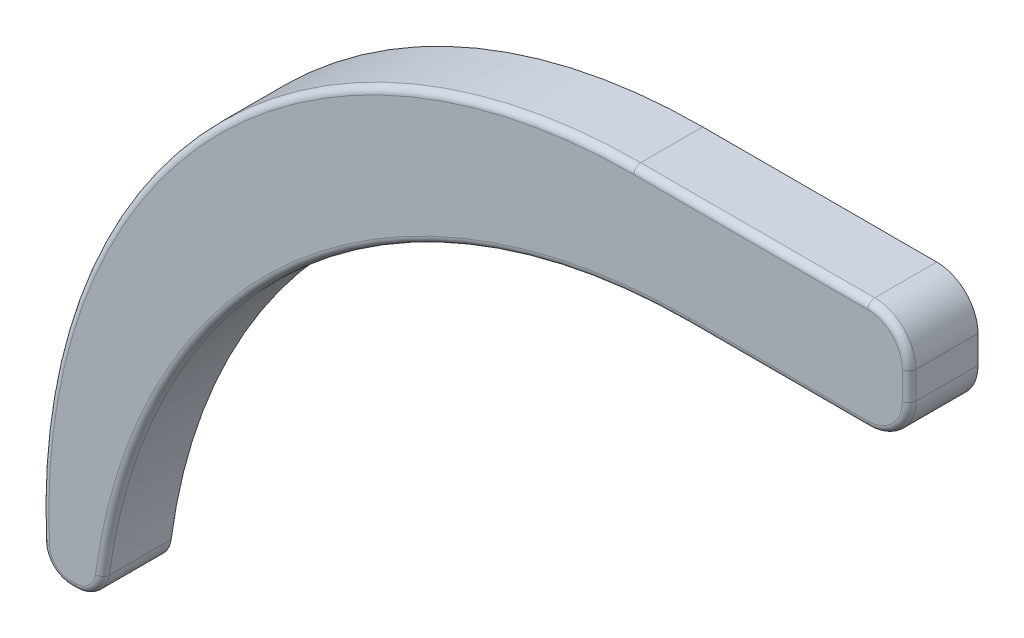
ISO-10303-21;
HEADER;
FILE_DESCRIPTION(('STEP AP214'),'2;1');
FILE_NAME('part.step','',(''),(''),'','','');
FILE_SCHEMA(('AUTOMOTIVE_DESIGN { 1 0 10303 214 1 1 1 1 }'));
ENDSEC;
DATA;
#1=APPLICATION_CONTEXT('core data for automotive mechanical design processes');
#2=APPLICATION_PROTOCOL_DEFINITION('international standard','automotive_design',2000,#1);
#3=PRODUCT_CONTEXT('',#1,'mechanical');
#4=PRODUCT('Part','Part','',(#3));
#5=PRODUCT_RELATED_PRODUCT_CATEGORY('part','',(#4));
#6=PRODUCT_DEFINITION_FORMATION('','',#4);
#7=PRODUCT_DEFINITION_CONTEXT('part definition',#1,'design');
#8=PRODUCT_DEFINITION('design','',#6,#7);
#9=PRODUCT_DEFINITION_SHAPE('','',#8);
#10=(LENGTH_UNIT() NAMED_UNIT(*) SI_UNIT(.MILLI.,.METRE.));
#11=(NAMED_UNIT(*) PLANE_ANGLE_UNIT() SI_UNIT($,.RADIAN.));
#12=(NAMED_UNIT(*) SI_UNIT($,.STERADIAN.) SOLID_ANGLE_UNIT());
#13=UNCERTAINTY_MEASURE_WITH_UNIT(LENGTH_MEASURE(1.E-05),#10,'distance_accuracy_value','');
#14=(GEOMETRIC_REPRESENTATION_CONTEXT(3) GLOBAL_UNCERTAINTY_ASSIGNED_CONTEXT((#13)) GLOBAL_UNIT_ASSIGNED_CONTEXT((#10,
#11,#12)) REPRESENTATION_CONTEXT('',''));
#15=CARTESIAN_POINT('',(0.,0.,0.));
#16=DIRECTION('',(0.,0.,1.));
#17=DIRECTION('',(1.,0.,0.));
#18=AXIS2_PLACEMENT_3D('',#15,#16,#17);
#19=CARTESIAN_POINT('',(0.352984216931022,2.,5.));
#20=DIRECTION('',(0.,0.,-1.));
#21=DIRECTION('',(-1.,0.,0.));
#22=AXIS2_PLACEMENT_3D('',#19,#20,#21);
#23=CYLINDRICAL_SURFACE('',#22,2.);
#24=DIRECTION('',(0.,0.,-1.));
#25=VECTOR('',#24,1.);
#26=CARTESIAN_POINT('',(2.33512671657349,1.73333333333333,5.));
#27=LINE('',#26,#25);
#28=CARTESIAN_POINT('',(2.33512671657349,1.73333333333333,4.5));
#29=VERTEX_POINT('',#28);
#30=CARTESIAN_POINT('',(2.33512671657349,1.73333333333333,0.));
#31=VERTEX_POINT('',#30);
#32=EDGE_CURVE('E141',#29,#31,#27,.T.);
#33=ORIENTED_EDGE('',*,*,#32,.F.);
#34=CARTESIAN_POINT('',(0.352984216931022,2.,4.5));
#35=DIRECTION('',(0.,0.,1.));
#36=DIRECTION('',(1.,0.,0.));
#37=AXIS2_PLACEMENT_3D('',#34,#35,#36);
#38=CIRCLE('',#37,2.);
#39=CARTESIAN_POINT('',(0.352984216931022,0.,4.5));
#40=VERTEX_POINT('',#39);
#41=EDGE_CURVE('E11',#29,#40,#38,.F.);
#42=ORIENTED_EDGE('',*,*,#41,.T.);
#43=DIRECTION('',(0.,0.,-1.));
#44=VECTOR('',#43,1.);
#45=CARTESIAN_POINT('',(0.352984216931022,0.,5.));
#46=LINE('',#45,#44);
#47=CARTESIAN_POINT('',(0.352984216931022,0.,0.));
#48=VERTEX_POINT('',#47);
#49=EDGE_CURVE('E162',#40,#48,#46,.T.);
#50=ORIENTED_EDGE('',*,*,#49,.T.);
#51=CARTESIAN_POINT('',(0.352984216931022,2.,0.));
#52=DIRECTION('',(0.,0.,1.));
#53=DIRECTION('',(1.,0.,0.));
#54=AXIS2_PLACEMENT_3D('',#51,#52,#53);
#55=CIRCLE('',#54,2.);
#56=EDGE_CURVE('E156',#48,#31,#55,.T.);
#57=ORIENTED_EDGE('',*,*,#56,.T.);
#58=EDGE_LOOP('',(#33,#42,#50,#57));
#59=FACE_BOUND('',#58,.T.);
#60=ADVANCED_FACE('F35',(#59),#23,.T.);
#61=CARTESIAN_POINT('',(44.9511904588866,-3.99999999999991,5.));
#62=DIRECTION('',(0.,0.,-1.));
#63=DIRECTION('',(-1.,0.,0.));
#64=AXIS2_PLACEMENT_3D('',#61,#62,#63);
#65=CYLINDRICAL_SURFACE('',#64,43.);
#66=DIRECTION('',(0.,0.,-1.));
#67=VECTOR('',#66,1.);
#68=CARTESIAN_POINT('',(44.9511904588866,39.0000000000001,5.));
#69=LINE('',#68,#67);
#70=CARTESIAN_POINT('',(44.9511904588866,39.0000000000001,4.5));
#71=VERTEX_POINT('',#70);
#72=CARTESIAN_POINT('',(44.9511904588866,39.0000000000001,0.));
#73=VERTEX_POINT('',#72);
#74=EDGE_CURVE('E150',#71,#73,#69,.T.);
#75=ORIENTED_EDGE('',*,*,#74,.F.);
#76=CARTESIAN_POINT('',(44.9511904588866,-3.99999999999991,4.5));
#77=DIRECTION('',(0.,0.,1.));
#78=DIRECTION('',(1.,0.,0.));
#79=AXIS2_PLACEMENT_3D('',#76,#77,#78);
#80=CIRCLE('',#79,43.);
#81=EDGE_CURVE('E44',#71,#29,#80,.T.);
#82=ORIENTED_EDGE('',*,*,#81,.T.);
#83=ORIENTED_EDGE('',*,*,#32,.T.);
#84=CARTESIAN_POINT('',(44.9511904588866,-3.99999999999991,0.));
#85=DIRECTION('',(0.,0.,-1.));
#86=DIRECTION('',(1.,0.,0.));
#87=AXIS2_PLACEMENT_3D('',#84,#85,#86);
#88=CIRCLE('',#87,43.);
#89=EDGE_CURVE('E144',#31,#73,#88,.T.);
#90=ORIENTED_EDGE('',*,*,#89,.T.);
#91=EDGE_LOOP('',(#75,#82,#83,#90));
#92=FACE_BOUND('',#91,.T.);
#93=ADVANCED_FACE('F143',(#92),#65,.F.);
#94=CARTESIAN_POINT('',(57.9511904588865,39.0000000000001,5.));
#95=DIRECTION('',(0.,1.,0.));
#96=DIRECTION('',(0.,0.,1.));
#97=AXIS2_PLACEMENT_3D('',#94,#95,#96);
#98=PLANE('',#97);
#99=DIRECTION('',(0.,0.,-1.));
#100=VECTOR('',#99,1.);
#101=CARTESIAN_POINT('',(57.9511904588865,39.0000000000001,5.));
#102=LINE('',#101,#100);
#103=CARTESIAN_POINT('',(57.9511904588865,39.0000000000001,4.5));
#104=VERTEX_POINT('',#103);
#105=CARTESIAN_POINT('',(57.9511904588865,39.0000000000001,0.));
#106=VERTEX_POINT('',#105);
#107=EDGE_CURVE('E202',#104,#106,#102,.T.);
#108=ORIENTED_EDGE('',*,*,#107,.F.);
#109=DIRECTION('',(1.,0.,0.));
#110=VECTOR('',#109,1.);
#111=CARTESIAN_POINT('',(44.9511904588866,39.0000000000001,4.5));
#112=LINE('',#111,#110);
#113=EDGE_CURVE('E59',#104,#71,#112,.F.);
#114=ORIENTED_EDGE('',*,*,#113,.T.);
#115=ORIENTED_EDGE('',*,*,#74,.T.);
#116=DIRECTION('',(1.,0.,0.));
#117=VECTOR('',#116,1.);
#118=CARTESIAN_POINT('',(57.9511904588865,39.0000000000001,0.));
#119=LINE('',#118,#117);
#120=EDGE_CURVE('E159',#73,#106,#119,.T.);
#121=ORIENTED_EDGE('',*,*,#120,.T.);
#122=EDGE_LOOP('',(#108,#114,#115,#121));
#123=FACE_BOUND('',#122,.T.);
#124=ADVANCED_FACE('F342',(#123),#98,.F.);
#125=CARTESIAN_POINT('',(57.9511904588865,42.0000000000001,5.));
#126=DIRECTION('',(0.,0.,-1.));
#127=DIRECTION('',(-1.,0.,0.));
#128=AXIS2_PLACEMENT_3D('',#125,#126,#127);
#129=CYLINDRICAL_SURFACE('',#128,3.);
#130=DIRECTION('',(0.,0.,-1.));
#131=VECTOR('',#130,1.);
#132=CARTESIAN_POINT('',(60.9511904588865,42.0000000000001,5.));
#133=LINE('',#132,#131);
#134=CARTESIAN_POINT('',(60.9511904588865,42.0000000000001,4.5));
#135=VERTEX_POINT('',#134);
#136=CARTESIAN_POINT('',(60.9511904588865,42.0000000000001,0.));
#137=VERTEX_POINT('',#136);
#138=EDGE_CURVE('E200',#135,#137,#133,.T.);
#139=ORIENTED_EDGE('',*,*,#138,.F.);
#140=CARTESIAN_POINT('',(57.9511904588865,42.0000000000001,4.5));
#141=DIRECTION('',(0.,0.,1.));
#142=DIRECTION('',(1.,0.,0.));
#143=AXIS2_PLACEMENT_3D('',#140,#141,#142);
#144=CIRCLE('',#143,3.);
#145=EDGE_CURVE('E238',#135,#104,#144,.F.);
#146=ORIENTED_EDGE('',*,*,#145,.T.);
#147=ORIENTED_EDGE('',*,*,#107,.T.);
#148=CARTESIAN_POINT('',(57.9511904588865,42.0000000000001,0.));
#149=DIRECTION('',(0.,0.,1.));
#150=DIRECTION('',(1.,0.,0.));
#151=AXIS2_PLACEMENT_3D('',#148,#149,#150);
#152=CIRCLE('',#151,3.);
#153=EDGE_CURVE('E169',#106,#137,#152,.T.);
#154=ORIENTED_EDGE('',*,*,#153,.T.);
#155=EDGE_LOOP('',(#139,#146,#147,#154));
#156=FACE_BOUND('',#155,.T.);
#157=ADVANCED_FACE('F472',(#156),#129,.T.);
#158=CARTESIAN_POINT('',(60.9511904588865,44.0000000000001,5.));
#159=DIRECTION('',(-1.,0.,0.));
#160=DIRECTION('',(0.,0.,1.));
#161=AXIS2_PLACEMENT_3D('',#158,#159,#160);
#162=PLANE('',#161);
#163=DIRECTION('',(0.,0.,-1.));
#164=VECTOR('',#163,1.);
#165=CARTESIAN_POINT('',(60.9511904588865,44.0000000000001,5.));
#166=LINE('',#165,#164);
#167=CARTESIAN_POINT('',(60.9511904588865,44.0000000000001,4.5));
#168=VERTEX_POINT('',#167);
#169=CARTESIAN_POINT('',(60.9511904588865,44.0000000000001,0.));
#170=VERTEX_POINT('',#169);
#171=EDGE_CURVE('E198',#168,#170,#166,.T.);
#172=ORIENTED_EDGE('',*,*,#171,.F.);
#173=DIRECTION('',(0.,1.,0.));
#174=VECTOR('',#173,1.);
#175=CARTESIAN_POINT('',(60.9511904588865,42.0000000000001,4.5));
#176=LINE('',#175,#174);
#177=EDGE_CURVE('E236',#168,#135,#176,.F.);
#178=ORIENTED_EDGE('',*,*,#177,.T.);
#179=ORIENTED_EDGE('',*,*,#138,.T.);
#180=DIRECTION('',(0.,1.,0.));
#181=VECTOR('',#180,1.);
#182=CARTESIAN_POINT('',(60.9511904588865,44.0000000000001,0.));
#183=LINE('',#182,#181);
#184=EDGE_CURVE('E172',#137,#170,#183,.T.);
#185=ORIENTED_EDGE('',*,*,#184,.T.);
#186=EDGE_LOOP('',(#172,#178,#179,#185));
#187=FACE_BOUND('',#186,.T.);
#188=ADVANCED_FACE('F464',(#187),#162,.F.);
#189=CARTESIAN_POINT('',(57.9511904588865,44.0000000000001,5.));
#190=DIRECTION('',(0.,0.,-1.));
#191=DIRECTION('',(-1.,0.,0.));
#192=AXIS2_PLACEMENT_3D('',#189,#190,#191);
#193=CYLINDRICAL_SURFACE('',#192,3.);
#194=DIRECTION('',(0.,0.,-1.));
#195=VECTOR('',#194,1.);
#196=CARTESIAN_POINT('',(57.9511904588865,47.0000000000001,5.));
#197=LINE('',#196,#195);
#198=CARTESIAN_POINT('',(57.9511904588865,47.0000000000001,4.5));
#199=VERTEX_POINT('',#198);
#200=CARTESIAN_POINT('',(57.9511904588865,47.0000000000001,0.));
#201=VERTEX_POINT('',#200);
#202=EDGE_CURVE('E196',#199,#201,#197,.T.);
#203=ORIENTED_EDGE('',*,*,#202,.F.);
#204=CARTESIAN_POINT('',(57.9511904588865,44.0000000000001,4.5));
#205=DIRECTION('',(0.,0.,1.));
#206=DIRECTION('',(1.,0.,0.));
#207=AXIS2_PLACEMENT_3D('',#204,#205,#206);
#208=CIRCLE('',#207,3.);
#209=EDGE_CURVE('E234',#199,#168,#208,.F.);
#210=ORIENTED_EDGE('',*,*,#209,.T.);
#211=ORIENTED_EDGE('',*,*,#171,.T.);
#212=CARTESIAN_POINT('',(57.9511904588865,44.0000000000001,0.));
#213=DIRECTION('',(0.,0.,1.));
#214=DIRECTION('',(1.,0.,0.));
#215=AXIS2_PLACEMENT_3D('',#212,#213,#214);
#216=CIRCLE('',#215,3.);
#217=EDGE_CURVE('E175',#170,#201,#216,.T.);
#218=ORIENTED_EDGE('',*,*,#217,.T.);
#219=EDGE_LOOP('',(#203,#210,#211,#218));
#220=FACE_BOUND('',#219,.T.);
#221=ADVANCED_FACE('F325',(#220),#193,.T.);
#222=CARTESIAN_POINT('',(40.9511904588861,47.0000000000001,5.));
#223=DIRECTION('',(0.,-1.,0.));
#224=DIRECTION('',(0.,0.,-1.));
#225=AXIS2_PLACEMENT_3D('',#222,#223,#224);
#226=PLANE('',#225);
#227=DIRECTION('',(0.,0.,-1.));
#228=VECTOR('',#227,1.);
#229=CARTESIAN_POINT('',(40.9511904588861,47.0000000000001,5.));
#230=LINE('',#229,#228);
#231=CARTESIAN_POINT('',(40.9511904588861,47.0000000000001,4.5));
#232=VERTEX_POINT('',#231);
#233=CARTESIAN_POINT('',(40.9511904588861,47.0000000000001,0.));
#234=VERTEX_POINT('',#233);
#235=EDGE_CURVE('E194',#232,#234,#230,.T.);
#236=ORIENTED_EDGE('',*,*,#235,.F.);
#237=DIRECTION('',(-1.,0.,0.));
#238=VECTOR('',#237,1.);
#239=CARTESIAN_POINT('',(57.9511904588865,47.0000000000001,4.5));
#240=LINE('',#239,#238);
#241=EDGE_CURVE('E232',#232,#199,#240,.F.);
#242=ORIENTED_EDGE('',*,*,#241,.T.);
#243=ORIENTED_EDGE('',*,*,#202,.T.);
#244=DIRECTION('',(-1.,0.,0.));
#245=VECTOR('',#244,1.);
#246=CARTESIAN_POINT('',(40.9511904588861,47.0000000000001,0.));
#247=LINE('',#246,#245);
#248=EDGE_CURVE('E178',#201,#234,#247,.T.);
#249=ORIENTED_EDGE('',*,*,#248,.T.);
#250=EDGE_LOOP('',(#236,#242,#243,#249));
#251=FACE_BOUND('',#250,.T.);
#252=ADVANCED_FACE('F322',(#251),#226,.F.);
#253=CARTESIAN_POINT('',(40.9511904588865,4.0000000000001,5.));
#254=DIRECTION('',(0.,0.,-1.));
#255=DIRECTION('',(-1.,0.,0.));
#256=AXIS2_PLACEMENT_3D('',#253,#254,#255);
#257=CYLINDRICAL_SURFACE('',#256,43.);
#258=DIRECTION('',(0.,0.,-1.));
#259=VECTOR('',#258,1.);
#260=CARTESIAN_POINT('',(-1.99761904677495,1.90243902439025,5.));
#261=LINE('',#260,#259);
#262=CARTESIAN_POINT('',(-1.99761904677495,1.90243902439025,4.5));
#263=VERTEX_POINT('',#262);
#264=CARTESIAN_POINT('',(-1.99761904677495,1.90243902439025,0.));
#265=VERTEX_POINT('',#264);
#266=EDGE_CURVE('E192',#263,#265,#261,.T.);
#267=ORIENTED_EDGE('',*,*,#266,.F.);
#268=CARTESIAN_POINT('',(40.9511904588865,4.0000000000001,4.5));
#269=DIRECTION('',(0.,0.,1.));
#270=DIRECTION('',(1.,0.,0.));
#271=AXIS2_PLACEMENT_3D('',#268,#269,#270);
#272=CIRCLE('',#271,43.);
#273=EDGE_CURVE('E230',#263,#232,#272,.F.);
#274=ORIENTED_EDGE('',*,*,#273,.T.);
#275=ORIENTED_EDGE('',*,*,#235,.T.);
#276=CARTESIAN_POINT('',(40.9511904588865,4.0000000000001,0.));
#277=DIRECTION('',(0.,0.,1.));
#278=DIRECTION('',(1.,0.,0.));
#279=AXIS2_PLACEMENT_3D('',#276,#277,#278);
#280=CIRCLE('',#279,43.);
#281=EDGE_CURVE('E181',#234,#265,#280,.T.);
#282=ORIENTED_EDGE('',*,*,#281,.T.);
#283=EDGE_LOOP('',(#267,#274,#275,#282));
#284=FACE_BOUND('',#283,.T.);
#285=ADVANCED_FACE('F308',(#284),#257,.T.);
#286=CARTESIAN_POINT('',(0.,2.,5.));
#287=DIRECTION('',(0.,0.,-1.));
#288=DIRECTION('',(-1.,0.,0.));
#289=AXIS2_PLACEMENT_3D('',#286,#287,#288);
#290=CYLINDRICAL_SURFACE('',#289,2.);
#291=DIRECTION('',(0.,0.,-1.));
#292=VECTOR('',#291,1.);
#293=CARTESIAN_POINT('',(0.,0.,5.));
#294=LINE('',#293,#292);
#295=CARTESIAN_POINT('',(0.,0.,4.5));
#296=VERTEX_POINT('',#295);
#297=CARTESIAN_POINT('',(0.,0.,0.));
#298=VERTEX_POINT('',#297);
#299=EDGE_CURVE('E190',#296,#298,#294,.T.);
#300=ORIENTED_EDGE('',*,*,#299,.F.);
#301=CARTESIAN_POINT('',(0.,2.,4.5));
#302=DIRECTION('',(0.,0.,1.));
#303=DIRECTION('',(1.,0.,0.));
#304=AXIS2_PLACEMENT_3D('',#301,#302,#303);
#305=CIRCLE('',#304,2.);
#306=EDGE_CURVE('E228',#296,#263,#305,.F.);
#307=ORIENTED_EDGE('',*,*,#306,.T.);
#308=ORIENTED_EDGE('',*,*,#266,.T.);
#309=CARTESIAN_POINT('',(0.,2.,0.));
#310=DIRECTION('',(0.,0.,1.));
#311=DIRECTION('',(1.,0.,0.));
#312=AXIS2_PLACEMENT_3D('',#309,#310,#311);
#313=CIRCLE('',#312,2.);
#314=EDGE_CURVE('E184',#265,#298,#313,.T.);
#315=ORIENTED_EDGE('',*,*,#314,.T.);
#316=EDGE_LOOP('',(#300,#307,#308,#315));
#317=FACE_BOUND('',#316,.T.);
#318=ADVANCED_FACE('F305',(#317),#290,.T.);
#319=CARTESIAN_POINT('',(0.352984216931022,0.,5.));
#320=DIRECTION('',(0.,1.,0.));
#321=DIRECTION('',(0.,0.,1.));
#322=AXIS2_PLACEMENT_3D('',#319,#320,#321);
#323=PLANE('',#322);
#324=ORIENTED_EDGE('',*,*,#49,.F.);
#325=DIRECTION('',(1.,0.,0.));
#326=VECTOR('',#325,1.);
#327=CARTESIAN_POINT('',(0.,0.,4.5));
#328=LINE('',#327,#326);
#329=EDGE_CURVE('E225',#40,#296,#328,.F.);
#330=ORIENTED_EDGE('',*,*,#329,.T.);
#331=ORIENTED_EDGE('',*,*,#299,.T.);
#332=DIRECTION('',(1.,0.,0.));
#333=VECTOR('',#332,1.);
#334=CARTESIAN_POINT('',(0.352984216931022,0.,0.));
#335=LINE('',#334,#333);
#336=EDGE_CURVE('E187',#298,#48,#335,.T.);
#337=ORIENTED_EDGE('',*,*,#336,.T.);
#338=EDGE_LOOP('',(#324,#330,#331,#337));
#339=FACE_BOUND('',#338,.T.);
#340=ADVANCED_FACE('F292',(#339),#323,.F.);
#341=CARTESIAN_POINT('',(0.352984216931022,2.,5.));
#342=DIRECTION('',(0.,0.,1.));
#343=DIRECTION('',(1.,0.,0.));
#344=AXIS2_PLACEMENT_3D('',#341,#342,#343);
#345=PLANE('',#344);
#346=CARTESIAN_POINT('',(0.,2.,5.));
#347=DIRECTION('',(0.,0.,1.));
#348=DIRECTION('',(1.,0.,0.));
#349=AXIS2_PLACEMENT_3D('',#346,#347,#348);
#350=CIRCLE('',#349,1.5);
#351=CARTESIAN_POINT('',(-1.49821428508121,1.92682926829268,5.));
#352=VERTEX_POINT('',#351);
#353=CARTESIAN_POINT('',(0.,0.500000000000002,5.));
#354=VERTEX_POINT('',#353);
#355=EDGE_CURVE('E220',#352,#354,#350,.T.);
#356=ORIENTED_EDGE('',*,*,#355,.T.);
#357=DIRECTION('',(1.,0.,0.));
#358=VECTOR('',#357,1.);
#359=CARTESIAN_POINT('',(0.352984216931022,0.5,5.));
#360=LINE('',#359,#358);
#361=CARTESIAN_POINT('',(0.352984216931022,0.500000000000002,5.));
#362=VERTEX_POINT('',#361);
#363=EDGE_CURVE('E222',#354,#362,#360,.T.);
#364=ORIENTED_EDGE('',*,*,#363,.T.);
#365=CARTESIAN_POINT('',(0.352984216931022,2.,5.));
#366=DIRECTION('',(0.,0.,1.));
#367=DIRECTION('',(1.,0.,0.));
#368=AXIS2_PLACEMENT_3D('',#365,#366,#367);
#369=CIRCLE('',#368,1.5);
#370=CARTESIAN_POINT('',(1.83959109166287,1.8,5.));
#371=VERTEX_POINT('',#370);
#372=EDGE_CURVE('E149',#362,#371,#369,.T.);
#373=ORIENTED_EDGE('',*,*,#372,.T.);
#374=CARTESIAN_POINT('',(44.9511904588866,-3.99999999999991,5.));
#375=DIRECTION('',(0.,0.,1.));
#376=DIRECTION('',(1.,0.,0.));
#377=AXIS2_PLACEMENT_3D('',#374,#375,#376);
#378=CIRCLE('',#377,43.5);
#379=CARTESIAN_POINT('',(44.9511904588866,39.5000000000001,5.));
#380=VERTEX_POINT('',#379);
#381=EDGE_CURVE('E206',#371,#380,#378,.F.);
#382=ORIENTED_EDGE('',*,*,#381,.T.);
#383=DIRECTION('',(1.,0.,0.));
#384=VECTOR('',#383,1.);
#385=CARTESIAN_POINT('',(57.9511904588865,39.5000000000001,5.));
#386=LINE('',#385,#384);
#387=CARTESIAN_POINT('',(57.9511904588865,39.5000000000001,5.));
#388=VERTEX_POINT('',#387);
#389=EDGE_CURVE('E208',#380,#388,#386,.T.);
#390=ORIENTED_EDGE('',*,*,#389,.T.);
#391=CARTESIAN_POINT('',(57.9511904588865,42.0000000000001,5.));
#392=DIRECTION('',(0.,0.,1.));
#393=DIRECTION('',(1.,0.,0.));
#394=AXIS2_PLACEMENT_3D('',#391,#392,#393);
#395=CIRCLE('',#394,2.5);
#396=CARTESIAN_POINT('',(60.4511904588865,42.0000000000001,5.));
#397=VERTEX_POINT('',#396);
#398=EDGE_CURVE('E210',#388,#397,#395,.T.);
#399=ORIENTED_EDGE('',*,*,#398,.T.);
#400=DIRECTION('',(0.,1.,0.));
#401=VECTOR('',#400,1.);
#402=CARTESIAN_POINT('',(60.4511904588865,44.0000000000001,5.));
#403=LINE('',#402,#401);
#404=CARTESIAN_POINT('',(60.4511904588865,44.0000000000001,5.));
#405=VERTEX_POINT('',#404);
#406=EDGE_CURVE('E212',#397,#405,#403,.T.);
#407=ORIENTED_EDGE('',*,*,#406,.T.);
#408=CARTESIAN_POINT('',(57.9511904588865,44.0000000000001,5.));
#409=DIRECTION('',(0.,0.,1.));
#410=DIRECTION('',(1.,0.,0.));
#411=AXIS2_PLACEMENT_3D('',#408,#409,#410);
#412=CIRCLE('',#411,2.5);
#413=CARTESIAN_POINT('',(57.9511904588865,46.5000000000001,5.));
#414=VERTEX_POINT('',#413);
#415=EDGE_CURVE('E214',#405,#414,#412,.T.);
#416=ORIENTED_EDGE('',*,*,#415,.T.);
#417=DIRECTION('',(-1.,0.,0.));
#418=VECTOR('',#417,1.);
#419=CARTESIAN_POINT('',(40.9511904588861,46.5000000000001,5.));
#420=LINE('',#419,#418);
#421=CARTESIAN_POINT('',(40.9511904588861,46.5000000000001,5.));
#422=VERTEX_POINT('',#421);
#423=EDGE_CURVE('E216',#414,#422,#420,.T.);
#424=ORIENTED_EDGE('',*,*,#423,.T.);
#425=CARTESIAN_POINT('',(40.9511904588865,4.0000000000001,5.));
#426=DIRECTION('',(0.,0.,1.));
#427=DIRECTION('',(1.,0.,0.));
#428=AXIS2_PLACEMENT_3D('',#425,#426,#427);
#429=CIRCLE('',#428,42.5);
#430=EDGE_CURVE('E218',#422,#352,#429,.T.);
#431=ORIENTED_EDGE('',*,*,#430,.T.);
#432=EDGE_LOOP('',(#356,#364,#373,#382,#390,#399,#407,#416,#424,#431));
#433=FACE_BOUND('',#432,.T.);
#434=ADVANCED_FACE('F276',(#433),#345,.T.);
#435=CARTESIAN_POINT('',(0.352984216931022,2.,0.));
#436=DIRECTION('',(0.,0.,1.));
#437=DIRECTION('',(1.,0.,0.));
#438=AXIS2_PLACEMENT_3D('',#435,#436,#437);
#439=PLANE('',#438);
#440=ORIENTED_EDGE('',*,*,#56,.F.);
#441=ORIENTED_EDGE('',*,*,#336,.F.);
#442=ORIENTED_EDGE('',*,*,#314,.F.);
#443=ORIENTED_EDGE('',*,*,#281,.F.);
#444=ORIENTED_EDGE('',*,*,#248,.F.);
#445=ORIENTED_EDGE('',*,*,#217,.F.);
#446=ORIENTED_EDGE('',*,*,#184,.F.);
#447=ORIENTED_EDGE('',*,*,#153,.F.);
#448=ORIENTED_EDGE('',*,*,#120,.F.);
#449=ORIENTED_EDGE('',*,*,#89,.F.);
#450=EDGE_LOOP('',(#440,#441,#442,#443,#444,#445,#446,#447,#448,#449));
#451=FACE_BOUND('',#450,.T.);
#452=ADVANCED_FACE('F154',(#451),#439,.F.);
#453=CARTESIAN_POINT('',(60.4511904588865,2.,4.5));
#454=DIRECTION('',(0.,-1.,0.));
#455=DIRECTION('',(0.,0.,-1.));
#456=AXIS2_PLACEMENT_3D('',#453,#454,#455);
#457=CYLINDRICAL_SURFACE('',#456,0.5);
#458=CARTESIAN_POINT('',(60.4511904588865,42.0000000000001,4.5));
#459=DIRECTION('',(0.,-1.,0.));
#460=DIRECTION('',(0.,0.,-1.));
#461=AXIS2_PLACEMENT_3D('',#458,#459,#460);
#462=CIRCLE('',#461,0.5);
#463=EDGE_CURVE('E166',#135,#397,#462,.T.);
#464=ORIENTED_EDGE('',*,*,#463,.F.);
#465=ORIENTED_EDGE('',*,*,#177,.F.);
#466=CARTESIAN_POINT('',(60.4511904588865,44.0000000000001,4.5));
#467=DIRECTION('',(0.,1.,0.));
#468=DIRECTION('',(0.,0.,1.));
#469=AXIS2_PLACEMENT_3D('',#466,#467,#468);
#470=CIRCLE('',#469,0.5);
#471=EDGE_CURVE('E39',#405,#168,#470,.T.);
#472=ORIENTED_EDGE('',*,*,#471,.F.);
#473=ORIENTED_EDGE('',*,*,#406,.F.);
#474=EDGE_LOOP('',(#464,#465,#472,#473));
#475=FACE_BOUND('',#474,.T.);
#476=ADVANCED_FACE('F37',(#475),#457,.T.);
#477=CARTESIAN_POINT('',(57.9511904588865,44.0000000000001,4.5));
#478=DIRECTION('',(0.,0.,1.));
#479=DIRECTION('',(1.,0.,0.));
#480=AXIS2_PLACEMENT_3D('',#477,#478,#479);
#481=TOROIDAL_SURFACE('',#480,2.5,0.5);
#482=ORIENTED_EDGE('',*,*,#471,.T.);
#483=ORIENTED_EDGE('',*,*,#209,.F.);
#484=CARTESIAN_POINT('',(57.9511904588865,46.5000000000001,4.5));
#485=DIRECTION('',(-1.,0.,0.));
#486=DIRECTION('',(0.,0.,1.));
#487=AXIS2_PLACEMENT_3D('',#484,#485,#486);
#488=CIRCLE('',#487,0.5);
#489=EDGE_CURVE('E261',#414,#199,#488,.T.);
#490=ORIENTED_EDGE('',*,*,#489,.F.);
#491=ORIENTED_EDGE('',*,*,#415,.F.);
#492=EDGE_LOOP('',(#482,#483,#490,#491));
#493=FACE_BOUND('',#492,.T.);
#494=ADVANCED_FACE('F330',(#493),#481,.T.);
#495=CARTESIAN_POINT('',(57.9511904588865,42.0000000000001,4.5));
#496=DIRECTION('',(0.,0.,1.));
#497=DIRECTION('',(1.,0.,0.));
#498=AXIS2_PLACEMENT_3D('',#495,#496,#497);
#499=TOROIDAL_SURFACE('',#498,2.5,0.5);
#500=ORIENTED_EDGE('',*,*,#463,.T.);
#501=ORIENTED_EDGE('',*,*,#398,.F.);
#502=CARTESIAN_POINT('',(57.9511904588865,39.5000000000001,4.5));
#503=DIRECTION('',(-1.,0.,0.));
#504=DIRECTION('',(0.,0.,1.));
#505=AXIS2_PLACEMENT_3D('',#502,#503,#504);
#506=CIRCLE('',#505,0.5);
#507=EDGE_CURVE('E258',#104,#388,#506,.T.);
#508=ORIENTED_EDGE('',*,*,#507,.F.);
#509=ORIENTED_EDGE('',*,*,#145,.F.);
#510=EDGE_LOOP('',(#500,#501,#508,#509));
#511=FACE_BOUND('',#510,.T.);
#512=ADVANCED_FACE('F268',(#511),#499,.T.);
#513=CARTESIAN_POINT('',(0.352984216931022,46.5000000000001,4.5));
#514=DIRECTION('',(1.,0.,0.));
#515=DIRECTION('',(0.,0.,-1.));
#516=AXIS2_PLACEMENT_3D('',#513,#514,#515);
#517=CYLINDRICAL_SURFACE('',#516,0.5);
#518=ORIENTED_EDGE('',*,*,#489,.T.);
#519=ORIENTED_EDGE('',*,*,#241,.F.);
#520=CARTESIAN_POINT('',(40.9511904588861,46.5000000000001,4.5));
#521=DIRECTION('',(-1.,0.,0.));
#522=DIRECTION('',(0.,-1.,0.));
#523=AXIS2_PLACEMENT_3D('',#520,#521,#522);
#524=CIRCLE('',#523,0.5);
#525=EDGE_CURVE('E255',#422,#232,#524,.T.);
#526=ORIENTED_EDGE('',*,*,#525,.F.);
#527=ORIENTED_EDGE('',*,*,#423,.F.);
#528=EDGE_LOOP('',(#518,#519,#526,#527));
#529=FACE_BOUND('',#528,.T.);
#530=ADVANCED_FACE('F319',(#529),#517,.T.);
#531=CARTESIAN_POINT('',(0.352984216931022,39.5000000000001,4.5));
#532=DIRECTION('',(-1.,0.,0.));
#533=DIRECTION('',(0.,0.,1.));
#534=AXIS2_PLACEMENT_3D('',#531,#532,#533);
#535=CYLINDRICAL_SURFACE('',#534,0.5);
#536=ORIENTED_EDGE('',*,*,#507,.T.);
#537=ORIENTED_EDGE('',*,*,#389,.F.);
#538=CARTESIAN_POINT('',(44.9511904588866,39.5000000000001,4.5));
#539=DIRECTION('',(-1.,0.,0.));
#540=DIRECTION('',(0.,0.,1.));
#541=AXIS2_PLACEMENT_3D('',#538,#539,#540);
#542=CIRCLE('',#541,0.5);
#543=EDGE_CURVE('E252',#71,#380,#542,.T.);
#544=ORIENTED_EDGE('',*,*,#543,.F.);
#545=ORIENTED_EDGE('',*,*,#113,.F.);
#546=EDGE_LOOP('',(#536,#537,#544,#545));
#547=FACE_BOUND('',#546,.T.);
#548=ADVANCED_FACE('F282',(#547),#535,.T.);
#549=CARTESIAN_POINT('',(40.9511904588865,4.0000000000001,4.5));
#550=DIRECTION('',(0.,0.,1.));
#551=DIRECTION('',(1.,0.,0.));
#552=AXIS2_PLACEMENT_3D('',#549,#550,#551);
#553=TOROIDAL_SURFACE('',#552,42.5,0.5);
#554=ORIENTED_EDGE('',*,*,#525,.T.);
#555=ORIENTED_EDGE('',*,*,#273,.F.);
#556=CARTESIAN_POINT('',(-1.49821428508121,1.92682926829268,4.5));
#557=DIRECTION('',(0.0487804878048781,-0.998809523387477,0.));
#558=DIRECTION('',(0.998809523387477,0.0487804878048781,0.));
#559=AXIS2_PLACEMENT_3D('',#556,#557,#558);
#560=CIRCLE('',#559,0.5);
#561=EDGE_CURVE('E249',#352,#263,#560,.T.);
#562=ORIENTED_EDGE('',*,*,#561,.F.);
#563=ORIENTED_EDGE('',*,*,#430,.F.);
#564=EDGE_LOOP('',(#554,#555,#562,#563));
#565=FACE_BOUND('',#564,.T.);
#566=ADVANCED_FACE('F313',(#565),#553,.T.);
#567=CARTESIAN_POINT('',(44.9511904588866,-3.99999999999991,4.5));
#568=DIRECTION('',(0.,0.,1.));
#569=DIRECTION('',(1.,0.,0.));
#570=AXIS2_PLACEMENT_3D('',#567,#568,#569);
#571=TOROIDAL_SURFACE('',#570,43.5,0.5);
#572=ORIENTED_EDGE('',*,*,#543,.T.);
#573=ORIENTED_EDGE('',*,*,#381,.F.);
#574=CARTESIAN_POINT('',(1.83959109166286,1.8,4.5));
#575=DIRECTION('',(-0.133333333333331,-0.991071249821234,0.));
#576=DIRECTION('',(0.991071249821234,-0.133333333333331,0.));
#577=AXIS2_PLACEMENT_3D('',#574,#575,#576);
#578=CIRCLE('',#577,0.5);
#579=EDGE_CURVE('E246',#29,#371,#578,.T.);
#580=ORIENTED_EDGE('',*,*,#579,.F.);
#581=ORIENTED_EDGE('',*,*,#81,.F.);
#582=EDGE_LOOP('',(#572,#573,#580,#581));
#583=FACE_BOUND('',#582,.T.);
#584=ADVANCED_FACE('F284',(#583),#571,.T.);
#585=CARTESIAN_POINT('',(0.,2.,4.5));
#586=DIRECTION('',(0.,0.,1.));
#587=DIRECTION('',(1.,0.,0.));
#588=AXIS2_PLACEMENT_3D('',#585,#586,#587);
#589=TOROIDAL_SURFACE('',#588,1.5,0.5);
#590=ORIENTED_EDGE('',*,*,#561,.T.);
#591=ORIENTED_EDGE('',*,*,#306,.F.);
#592=CARTESIAN_POINT('',(0.,0.500000000000002,4.5));
#593=DIRECTION('',(1.,0.,0.));
#594=DIRECTION('',(0.,0.,-1.));
#595=AXIS2_PLACEMENT_3D('',#592,#593,#594);
#596=CIRCLE('',#595,0.5);
#597=EDGE_CURVE('E244',#354,#296,#596,.T.);
#598=ORIENTED_EDGE('',*,*,#597,.F.);
#599=ORIENTED_EDGE('',*,*,#355,.F.);
#600=EDGE_LOOP('',(#590,#591,#598,#599));
#601=FACE_BOUND('',#600,.T.);
#602=ADVANCED_FACE('F301',(#601),#589,.T.);
#603=CARTESIAN_POINT('',(0.352984216931022,2.,4.5));
#604=DIRECTION('',(0.,0.,1.));
#605=DIRECTION('',(1.,0.,0.));
#606=AXIS2_PLACEMENT_3D('',#603,#604,#605);
#607=TOROIDAL_SURFACE('',#606,1.5,0.5);
#608=ORIENTED_EDGE('',*,*,#579,.T.);
#609=ORIENTED_EDGE('',*,*,#372,.F.);
#610=CARTESIAN_POINT('',(0.352984216931022,0.500000000000002,4.5));
#611=DIRECTION('',(-1.,0.,0.));
#612=DIRECTION('',(0.,0.,1.));
#613=AXIS2_PLACEMENT_3D('',#610,#611,#612);
#614=CIRCLE('',#613,0.5);
#615=EDGE_CURVE('E242',#40,#362,#614,.T.);
#616=ORIENTED_EDGE('',*,*,#615,.F.);
#617=ORIENTED_EDGE('',*,*,#41,.F.);
#618=EDGE_LOOP('',(#608,#609,#616,#617));
#619=FACE_BOUND('',#618,.T.);
#620=ADVANCED_FACE('F289',(#619),#607,.T.);
#621=CARTESIAN_POINT('',(0.352984216931022,0.5,4.5));
#622=DIRECTION('',(-1.,0.,0.));
#623=DIRECTION('',(0.,0.,1.));
#624=AXIS2_PLACEMENT_3D('',#621,#622,#623);
#625=CYLINDRICAL_SURFACE('',#624,0.5);
#626=ORIENTED_EDGE('',*,*,#597,.T.);
#627=ORIENTED_EDGE('',*,*,#329,.F.);
#628=ORIENTED_EDGE('',*,*,#615,.T.);
#629=ORIENTED_EDGE('',*,*,#363,.F.);
#630=EDGE_LOOP('',(#626,#627,#628,#629));
#631=FACE_BOUND('',#630,.T.);
#632=ADVANCED_FACE('F295',(#631),#625,.T.);
#633=CLOSED_SHELL('',(#60,#93,#124,#157,#188,#221,#252,#285,#318,#340,#434,#452,#476,#494,#512,
#530,#548,#566,#584,#602,#620,#632));
#634=MANIFOLD_SOLID_BREP('B2',#633);
#635=ADVANCED_BREP_SHAPE_REPRESENTATION('',(#18,#634),#14);
#636=SHAPE_DEFINITION_REPRESENTATION(#9,#635);
ENDSEC;
END-ISO-10303-21;
